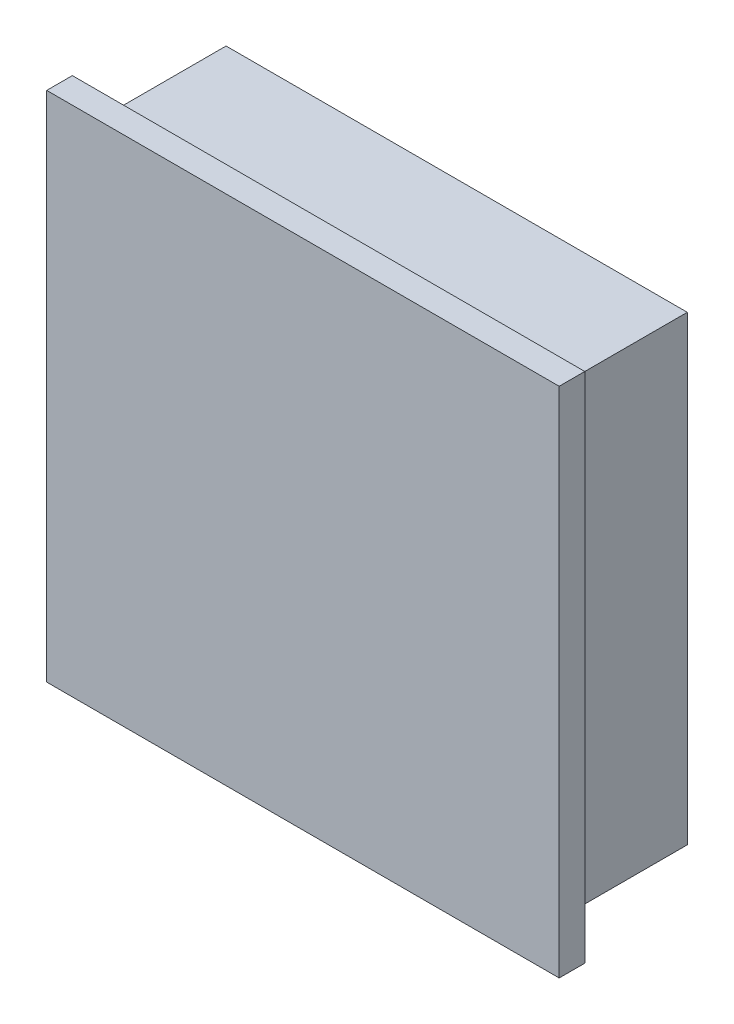
ISO-10303-21;
HEADER;
FILE_DESCRIPTION(('STEP AP214'),'2;1');
FILE_NAME('part.step','',(''),(''),'','','');
FILE_SCHEMA(('AUTOMOTIVE_DESIGN { 1 0 10303 214 1 1 1 1 }'));
ENDSEC;
DATA;
#1=APPLICATION_CONTEXT('core data for automotive mechanical design processes');
#2=APPLICATION_PROTOCOL_DEFINITION('international standard','automotive_design',2000,#1);
#3=PRODUCT_CONTEXT('',#1,'mechanical');
#4=PRODUCT('Part','Part','',(#3));
#5=PRODUCT_RELATED_PRODUCT_CATEGORY('part','',(#4));
#6=PRODUCT_DEFINITION_FORMATION('','',#4);
#7=PRODUCT_DEFINITION_CONTEXT('part definition',#1,'design');
#8=PRODUCT_DEFINITION('design','',#6,#7);
#9=PRODUCT_DEFINITION_SHAPE('','',#8);
#10=(LENGTH_UNIT() NAMED_UNIT(*) SI_UNIT(.MILLI.,.METRE.));
#11=(NAMED_UNIT(*) PLANE_ANGLE_UNIT() SI_UNIT($,.RADIAN.));
#12=(NAMED_UNIT(*) SI_UNIT($,.STERADIAN.) SOLID_ANGLE_UNIT());
#13=UNCERTAINTY_MEASURE_WITH_UNIT(LENGTH_MEASURE(1.E-05),#10,'distance_accuracy_value','');
#14=(GEOMETRIC_REPRESENTATION_CONTEXT(3) GLOBAL_UNCERTAINTY_ASSIGNED_CONTEXT((#13)) GLOBAL_UNIT_ASSIGNED_CONTEXT((#10,
#11,#12)) REPRESENTATION_CONTEXT('',''));
#15=CARTESIAN_POINT('',(0.,0.,0.));
#16=DIRECTION('',(0.,0.,1.));
#17=DIRECTION('',(1.,0.,0.));
#18=AXIS2_PLACEMENT_3D('',#15,#16,#17);
#19=CARTESIAN_POINT('',(0.,0.,10.));
#20=DIRECTION('',(1.,0.,0.));
#21=DIRECTION('',(0.,1.,0.));
#22=AXIS2_PLACEMENT_3D('',#19,#20,#21);
#23=PLANE('',#22);
#24=DIRECTION('',(0.,-1.,0.));
#25=VECTOR('',#24,1.);
#26=CARTESIAN_POINT('',(0.,0.,0.));
#27=LINE('',#26,#25);
#28=CARTESIAN_POINT('',(0.,36.,0.));
#29=VERTEX_POINT('',#28);
#30=CARTESIAN_POINT('',(0.,0.,0.));
#31=VERTEX_POINT('',#30);
#32=EDGE_CURVE('E131',#29,#31,#27,.T.);
#33=ORIENTED_EDGE('',*,*,#32,.T.);
#34=DIRECTION('',(0.,0.,-1.));
#35=VECTOR('',#34,1.);
#36=CARTESIAN_POINT('',(0.,0.,10.));
#37=LINE('',#36,#35);
#38=CARTESIAN_POINT('',(0.,0.,10.));
#39=VERTEX_POINT('',#38);
#40=EDGE_CURVE('E11',#39,#31,#37,.T.);
#41=ORIENTED_EDGE('',*,*,#40,.F.);
#42=DIRECTION('',(0.,-1.,0.));
#43=VECTOR('',#42,1.);
#44=CARTESIAN_POINT('',(0.,0.,10.));
#45=LINE('',#44,#43);
#46=CARTESIAN_POINT('',(0.,36.,10.));
#47=VERTEX_POINT('',#46);
#48=EDGE_CURVE('E140',#47,#39,#45,.T.);
#49=ORIENTED_EDGE('',*,*,#48,.F.);
#50=DIRECTION('',(0.,0.,-1.));
#51=VECTOR('',#50,1.);
#52=CARTESIAN_POINT('',(0.,36.,10.));
#53=LINE('',#52,#51);
#54=EDGE_CURVE('E149',#47,#29,#53,.T.);
#55=ORIENTED_EDGE('',*,*,#54,.T.);
#56=EDGE_LOOP('',(#33,#41,#49,#55));
#57=FACE_BOUND('',#56,.T.);
#58=ADVANCED_FACE('F33',(#57),#23,.F.);
#59=CARTESIAN_POINT('',(0.,0.,10.));
#60=DIRECTION('',(0.,1.,0.));
#61=DIRECTION('',(0.,0.,1.));
#62=AXIS2_PLACEMENT_3D('',#59,#60,#61);
#63=PLANE('',#62);
#64=DIRECTION('',(1.,0.,0.));
#65=VECTOR('',#64,1.);
#66=CARTESIAN_POINT('',(0.,0.,0.));
#67=LINE('',#66,#65);
#68=CARTESIAN_POINT('',(36.,0.,0.));
#69=VERTEX_POINT('',#68);
#70=EDGE_CURVE('E134',#31,#69,#67,.T.);
#71=ORIENTED_EDGE('',*,*,#70,.T.);
#72=DIRECTION('',(0.,0.,-1.));
#73=VECTOR('',#72,1.);
#74=CARTESIAN_POINT('',(36.,0.,10.));
#75=LINE('',#74,#73);
#76=CARTESIAN_POINT('',(36.,0.,10.));
#77=VERTEX_POINT('',#76);
#78=EDGE_CURVE('E41',#77,#69,#75,.T.);
#79=ORIENTED_EDGE('',*,*,#78,.F.);
#80=DIRECTION('',(1.,0.,0.));
#81=VECTOR('',#80,1.);
#82=CARTESIAN_POINT('',(0.,0.,10.));
#83=LINE('',#82,#81);
#84=EDGE_CURVE('E75',#39,#77,#83,.T.);
#85=ORIENTED_EDGE('',*,*,#84,.F.);
#86=ORIENTED_EDGE('',*,*,#40,.T.);
#87=EDGE_LOOP('',(#71,#79,#85,#86));
#88=FACE_BOUND('',#87,.T.);
#89=ADVANCED_FACE('F175',(#88),#63,.F.);
#90=CARTESIAN_POINT('',(36.,0.,10.));
#91=DIRECTION('',(-1.,0.,0.));
#92=DIRECTION('',(0.,-1.,0.));
#93=AXIS2_PLACEMENT_3D('',#90,#91,#92);
#94=PLANE('',#93);
#95=DIRECTION('',(0.,1.,0.));
#96=VECTOR('',#95,1.);
#97=CARTESIAN_POINT('',(36.,0.,0.));
#98=LINE('',#97,#96);
#99=CARTESIAN_POINT('',(36.,36.,0.));
#100=VERTEX_POINT('',#99);
#101=EDGE_CURVE('E65',#69,#100,#98,.T.);
#102=ORIENTED_EDGE('',*,*,#101,.T.);
#103=DIRECTION('',(0.,0.,-1.));
#104=VECTOR('',#103,1.);
#105=CARTESIAN_POINT('',(36.,36.,10.));
#106=LINE('',#105,#104);
#107=CARTESIAN_POINT('',(36.,36.,10.));
#108=VERTEX_POINT('',#107);
#109=EDGE_CURVE('E49',#108,#100,#106,.T.);
#110=ORIENTED_EDGE('',*,*,#109,.F.);
#111=DIRECTION('',(0.,1.,0.));
#112=VECTOR('',#111,1.);
#113=CARTESIAN_POINT('',(36.,0.,10.));
#114=LINE('',#113,#112);
#115=EDGE_CURVE('E144',#77,#108,#114,.T.);
#116=ORIENTED_EDGE('',*,*,#115,.F.);
#117=ORIENTED_EDGE('',*,*,#78,.T.);
#118=EDGE_LOOP('',(#102,#110,#116,#117));
#119=FACE_BOUND('',#118,.T.);
#120=ADVANCED_FACE('F155',(#119),#94,.F.);
#121=CARTESIAN_POINT('',(0.,36.,10.));
#122=DIRECTION('',(0.,-1.,0.));
#123=DIRECTION('',(0.,0.,-1.));
#124=AXIS2_PLACEMENT_3D('',#121,#122,#123);
#125=PLANE('',#124);
#126=DIRECTION('',(-1.,0.,0.));
#127=VECTOR('',#126,1.);
#128=CARTESIAN_POINT('',(0.,36.,0.));
#129=LINE('',#128,#127);
#130=EDGE_CURVE('E70',#100,#29,#129,.T.);
#131=ORIENTED_EDGE('',*,*,#130,.T.);
#132=ORIENTED_EDGE('',*,*,#54,.F.);
#133=DIRECTION('',(-1.,0.,0.));
#134=VECTOR('',#133,1.);
#135=CARTESIAN_POINT('',(0.,36.,10.));
#136=LINE('',#135,#134);
#137=EDGE_CURVE('E147',#108,#47,#136,.T.);
#138=ORIENTED_EDGE('',*,*,#137,.F.);
#139=ORIENTED_EDGE('',*,*,#109,.T.);
#140=EDGE_LOOP('',(#131,#132,#138,#139));
#141=FACE_BOUND('',#140,.T.);
#142=ADVANCED_FACE('F160',(#141),#125,.F.);
#143=CARTESIAN_POINT('',(0.,0.,0.));
#144=DIRECTION('',(0.,0.,-1.));
#145=DIRECTION('',(-1.,0.,0.));
#146=AXIS2_PLACEMENT_3D('',#143,#144,#145);
#147=PLANE('',#146);
#148=ORIENTED_EDGE('',*,*,#32,.F.);
#149=ORIENTED_EDGE('',*,*,#130,.F.);
#150=ORIENTED_EDGE('',*,*,#101,.F.);
#151=ORIENTED_EDGE('',*,*,#70,.F.);
#152=EDGE_LOOP('',(#148,#149,#150,#151));
#153=FACE_BOUND('',#152,.T.);
#154=ADVANCED_FACE('F158',(#153),#147,.T.);
#155=CARTESIAN_POINT('',(0.,0.,10.));
#156=DIRECTION('',(0.,0.,1.));
#157=DIRECTION('',(1.,0.,0.));
#158=AXIS2_PLACEMENT_3D('',#155,#156,#157);
#159=PLANE('',#158);
#160=DIRECTION('',(0.,-1.,0.));
#161=VECTOR('',#160,1.);
#162=CARTESIAN_POINT('',(-2.00000000000001,38.,10.));
#163=LINE('',#162,#161);
#164=CARTESIAN_POINT('',(-2.00000000000001,38.,10.));
#165=VERTEX_POINT('',#164);
#166=CARTESIAN_POINT('',(-2.,-2.,10.));
#167=VERTEX_POINT('',#166);
#168=EDGE_CURVE('E130',#165,#167,#163,.T.);
#169=ORIENTED_EDGE('',*,*,#168,.F.);
#170=DIRECTION('',(-1.,0.,0.));
#171=VECTOR('',#170,1.);
#172=CARTESIAN_POINT('',(-2.00000000000001,38.,10.));
#173=LINE('',#172,#171);
#174=CARTESIAN_POINT('',(38.,38.,10.));
#175=VERTEX_POINT('',#174);
#176=EDGE_CURVE('E126',#175,#165,#173,.T.);
#177=ORIENTED_EDGE('',*,*,#176,.F.);
#178=DIRECTION('',(0.,1.,0.));
#179=VECTOR('',#178,1.);
#180=CARTESIAN_POINT('',(38.,38.,10.));
#181=LINE('',#180,#179);
#182=CARTESIAN_POINT('',(38.,-2.,10.));
#183=VERTEX_POINT('',#182);
#184=EDGE_CURVE('E202',#183,#175,#181,.T.);
#185=ORIENTED_EDGE('',*,*,#184,.F.);
#186=DIRECTION('',(1.,0.,0.));
#187=VECTOR('',#186,1.);
#188=CARTESIAN_POINT('',(-2.,-2.,10.));
#189=LINE('',#188,#187);
#190=EDGE_CURVE('E205',#167,#183,#189,.T.);
#191=ORIENTED_EDGE('',*,*,#190,.F.);
#192=EDGE_LOOP('',(#169,#177,#185,#191));
#193=FACE_BOUND('',#192,.T.);
#194=ORIENTED_EDGE('',*,*,#137,.T.);
#195=ORIENTED_EDGE('',*,*,#48,.T.);
#196=ORIENTED_EDGE('',*,*,#84,.T.);
#197=ORIENTED_EDGE('',*,*,#115,.T.);
#198=EDGE_LOOP('',(#194,#195,#196,#197));
#199=FACE_BOUND('',#198,.T.);
#200=ADVANCED_FACE('F162',(#193,#199),#159,.F.);
#201=CARTESIAN_POINT('',(-2.00000000000001,38.,12.));
#202=DIRECTION('',(1.,0.,0.));
#203=DIRECTION('',(0.,1.,0.));
#204=AXIS2_PLACEMENT_3D('',#201,#202,#203);
#205=PLANE('',#204);
#206=ORIENTED_EDGE('',*,*,#168,.T.);
#207=DIRECTION('',(0.,0.,-1.));
#208=VECTOR('',#207,1.);
#209=CARTESIAN_POINT('',(-2.,-2.,12.));
#210=LINE('',#209,#208);
#211=CARTESIAN_POINT('',(-2.,-2.,12.));
#212=VERTEX_POINT('',#211);
#213=EDGE_CURVE('E110',#212,#167,#210,.T.);
#214=ORIENTED_EDGE('',*,*,#213,.F.);
#215=DIRECTION('',(0.,-1.,0.));
#216=VECTOR('',#215,1.);
#217=CARTESIAN_POINT('',(-2.00000000000001,38.,12.));
#218=LINE('',#217,#216);
#219=CARTESIAN_POINT('',(-2.00000000000001,38.,12.));
#220=VERTEX_POINT('',#219);
#221=EDGE_CURVE('E117',#220,#212,#218,.T.);
#222=ORIENTED_EDGE('',*,*,#221,.F.);
#223=DIRECTION('',(0.,0.,-1.));
#224=VECTOR('',#223,1.);
#225=CARTESIAN_POINT('',(-2.00000000000001,38.,12.));
#226=LINE('',#225,#224);
#227=EDGE_CURVE('E199',#220,#165,#226,.T.);
#228=ORIENTED_EDGE('',*,*,#227,.T.);
#229=EDGE_LOOP('',(#206,#214,#222,#228));
#230=FACE_BOUND('',#229,.T.);
#231=ADVANCED_FACE('F128',(#230),#205,.F.);
#232=CARTESIAN_POINT('',(-2.,-2.,12.));
#233=DIRECTION('',(0.,1.,0.));
#234=DIRECTION('',(0.,0.,1.));
#235=AXIS2_PLACEMENT_3D('',#232,#233,#234);
#236=PLANE('',#235);
#237=ORIENTED_EDGE('',*,*,#190,.T.);
#238=DIRECTION('',(0.,0.,-1.));
#239=VECTOR('',#238,1.);
#240=CARTESIAN_POINT('',(38.,-2.,12.));
#241=LINE('',#240,#239);
#242=CARTESIAN_POINT('',(38.,-2.,12.));
#243=VERTEX_POINT('',#242);
#244=EDGE_CURVE('E113',#243,#183,#241,.T.);
#245=ORIENTED_EDGE('',*,*,#244,.F.);
#246=DIRECTION('',(1.,0.,0.));
#247=VECTOR('',#246,1.);
#248=CARTESIAN_POINT('',(-2.,-2.,12.));
#249=LINE('',#248,#247);
#250=EDGE_CURVE('E106',#212,#243,#249,.T.);
#251=ORIENTED_EDGE('',*,*,#250,.F.);
#252=ORIENTED_EDGE('',*,*,#213,.T.);
#253=EDGE_LOOP('',(#237,#245,#251,#252));
#254=FACE_BOUND('',#253,.T.);
#255=ADVANCED_FACE('F108',(#254),#236,.F.);
#256=CARTESIAN_POINT('',(38.,38.,12.));
#257=DIRECTION('',(-1.,0.,0.));
#258=DIRECTION('',(0.,-1.,0.));
#259=AXIS2_PLACEMENT_3D('',#256,#257,#258);
#260=PLANE('',#259);
#261=ORIENTED_EDGE('',*,*,#184,.T.);
#262=DIRECTION('',(0.,0.,-1.));
#263=VECTOR('',#262,1.);
#264=CARTESIAN_POINT('',(38.,38.,12.));
#265=LINE('',#264,#263);
#266=CARTESIAN_POINT('',(38.,38.,12.));
#267=VERTEX_POINT('',#266);
#268=EDGE_CURVE('E136',#267,#175,#265,.T.);
#269=ORIENTED_EDGE('',*,*,#268,.F.);
#270=DIRECTION('',(0.,1.,0.));
#271=VECTOR('',#270,1.);
#272=CARTESIAN_POINT('',(38.,38.,12.));
#273=LINE('',#272,#271);
#274=EDGE_CURVE('E116',#243,#267,#273,.T.);
#275=ORIENTED_EDGE('',*,*,#274,.F.);
#276=ORIENTED_EDGE('',*,*,#244,.T.);
#277=EDGE_LOOP('',(#261,#269,#275,#276));
#278=FACE_BOUND('',#277,.T.);
#279=ADVANCED_FACE('F188',(#278),#260,.F.);
#280=CARTESIAN_POINT('',(-2.00000000000001,38.,12.));
#281=DIRECTION('',(0.,-1.,0.));
#282=DIRECTION('',(0.,0.,-1.));
#283=AXIS2_PLACEMENT_3D('',#280,#281,#282);
#284=PLANE('',#283);
#285=ORIENTED_EDGE('',*,*,#176,.T.);
#286=ORIENTED_EDGE('',*,*,#227,.F.);
#287=DIRECTION('',(-1.,0.,0.));
#288=VECTOR('',#287,1.);
#289=CARTESIAN_POINT('',(-2.00000000000001,38.,12.));
#290=LINE('',#289,#288);
#291=EDGE_CURVE('E122',#267,#220,#290,.T.);
#292=ORIENTED_EDGE('',*,*,#291,.F.);
#293=ORIENTED_EDGE('',*,*,#268,.T.);
#294=EDGE_LOOP('',(#285,#286,#292,#293));
#295=FACE_BOUND('',#294,.T.);
#296=ADVANCED_FACE('F190',(#295),#284,.F.);
#297=CARTESIAN_POINT('',(0.,0.,12.));
#298=DIRECTION('',(0.,0.,1.));
#299=DIRECTION('',(1.,0.,0.));
#300=AXIS2_PLACEMENT_3D('',#297,#298,#299);
#301=PLANE('',#300);
#302=ORIENTED_EDGE('',*,*,#221,.T.);
#303=ORIENTED_EDGE('',*,*,#250,.T.);
#304=ORIENTED_EDGE('',*,*,#274,.T.);
#305=ORIENTED_EDGE('',*,*,#291,.T.);
#306=EDGE_LOOP('',(#302,#303,#304,#305));
#307=FACE_BOUND('',#306,.T.);
#308=ADVANCED_FACE('F120',(#307),#301,.T.);
#309=CLOSED_SHELL('',(#58,#89,#120,#142,#154,#200,#231,#255,#279,#296,#308));
#310=MANIFOLD_SOLID_BREP('B2',#309);
#311=ADVANCED_BREP_SHAPE_REPRESENTATION('',(#18,#310),#14);
#312=SHAPE_DEFINITION_REPRESENTATION(#9,#311);
ENDSEC;
END-ISO-10303-21;
